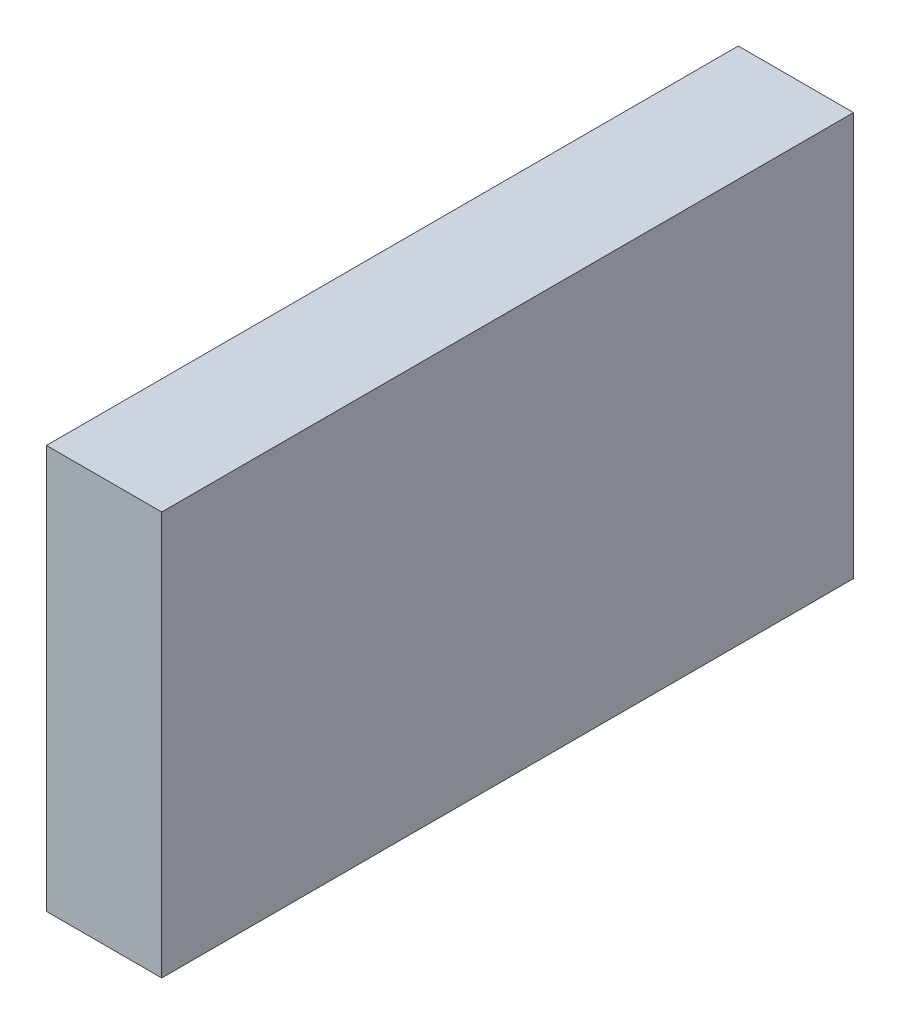
ISO-10303-21;
HEADER;
FILE_DESCRIPTION(('STEP AP214'),'2;1');
FILE_NAME('part.step','',(''),(''),'','','');
FILE_SCHEMA(('AUTOMOTIVE_DESIGN { 1 0 10303 214 1 1 1 1 }'));
ENDSEC;
DATA;
#1=APPLICATION_CONTEXT('core data for automotive mechanical design processes');
#2=APPLICATION_PROTOCOL_DEFINITION('international standard','automotive_design',2000,#1);
#3=PRODUCT_CONTEXT('',#1,'mechanical');
#4=PRODUCT('Part','Part','',(#3));
#5=PRODUCT_RELATED_PRODUCT_CATEGORY('part','',(#4));
#6=PRODUCT_DEFINITION_FORMATION('','',#4);
#7=PRODUCT_DEFINITION_CONTEXT('part definition',#1,'design');
#8=PRODUCT_DEFINITION('design','',#6,#7);
#9=PRODUCT_DEFINITION_SHAPE('','',#8);
#10=(LENGTH_UNIT() NAMED_UNIT(*) SI_UNIT(.MILLI.,.METRE.));
#11=(NAMED_UNIT(*) PLANE_ANGLE_UNIT() SI_UNIT($,.RADIAN.));
#12=(NAMED_UNIT(*) SI_UNIT($,.STERADIAN.) SOLID_ANGLE_UNIT());
#13=UNCERTAINTY_MEASURE_WITH_UNIT(LENGTH_MEASURE(1.E-05),#10,'distance_accuracy_value','');
#14=(GEOMETRIC_REPRESENTATION_CONTEXT(3) GLOBAL_UNCERTAINTY_ASSIGNED_CONTEXT((#13)) GLOBAL_UNIT_ASSIGNED_CONTEXT((#10,
#11,#12)) REPRESENTATION_CONTEXT('',''));
#15=CARTESIAN_POINT('',(0.,0.,0.));
#16=DIRECTION('',(0.,0.,1.));
#17=DIRECTION('',(1.,0.,0.));
#18=AXIS2_PLACEMENT_3D('',#15,#16,#17);
#19=CARTESIAN_POINT('',(-25.4,-88.9,304.8));
#20=DIRECTION('',(1.,0.,0.));
#21=DIRECTION('',(0.,0.,-1.));
#22=AXIS2_PLACEMENT_3D('',#19,#20,#21);
#23=PLANE('',#22);
#24=DIRECTION('',(0.,-1.,0.));
#25=VECTOR('',#24,1.);
#26=CARTESIAN_POINT('',(-25.4,-88.9,0.));
#27=LINE('',#26,#25);
#28=CARTESIAN_POINT('',(-25.4,88.9,0.));
#29=VERTEX_POINT('',#28);
#30=CARTESIAN_POINT('',(-25.4,-88.9,0.));
#31=VERTEX_POINT('',#30);
#32=EDGE_CURVE('E113',#29,#31,#27,.T.);
#33=ORIENTED_EDGE('',*,*,#32,.T.);
#34=DIRECTION('',(0.,0.,-1.));
#35=VECTOR('',#34,1.);
#36=CARTESIAN_POINT('',(-25.4,-88.9,304.8));
#37=LINE('',#36,#35);
#38=CARTESIAN_POINT('',(-25.4,-88.9,304.8));
#39=VERTEX_POINT('',#38);
#40=EDGE_CURVE('E11',#39,#31,#37,.T.);
#41=ORIENTED_EDGE('',*,*,#40,.F.);
#42=DIRECTION('',(0.,-1.,0.));
#43=VECTOR('',#42,1.);
#44=CARTESIAN_POINT('',(-25.4,-88.9,304.8));
#45=LINE('',#44,#43);
#46=CARTESIAN_POINT('',(-25.4,88.9,304.8));
#47=VERTEX_POINT('',#46);
#48=EDGE_CURVE('E97',#47,#39,#45,.T.);
#49=ORIENTED_EDGE('',*,*,#48,.F.);
#50=DIRECTION('',(0.,0.,-1.));
#51=VECTOR('',#50,1.);
#52=CARTESIAN_POINT('',(-25.4,88.9,304.8));
#53=LINE('',#52,#51);
#54=EDGE_CURVE('E109',#47,#29,#53,.T.);
#55=ORIENTED_EDGE('',*,*,#54,.T.);
#56=EDGE_LOOP('',(#33,#41,#49,#55));
#57=FACE_BOUND('',#56,.T.);
#58=ADVANCED_FACE('F45',(#57),#23,.F.);
#59=CARTESIAN_POINT('',(25.4,-88.9,304.8));
#60=DIRECTION('',(0.,1.,0.));
#61=DIRECTION('',(-1.,0.,0.));
#62=AXIS2_PLACEMENT_3D('',#59,#60,#61);
#63=PLANE('',#62);
#64=DIRECTION('',(1.,0.,0.));
#65=VECTOR('',#64,1.);
#66=CARTESIAN_POINT('',(25.4,-88.9,0.));
#67=LINE('',#66,#65);
#68=CARTESIAN_POINT('',(25.4,-88.9,0.));
#69=VERTEX_POINT('',#68);
#70=EDGE_CURVE('E102',#31,#69,#67,.T.);
#71=ORIENTED_EDGE('',*,*,#70,.T.);
#72=DIRECTION('',(0.,0.,-1.));
#73=VECTOR('',#72,1.);
#74=CARTESIAN_POINT('',(25.4,-88.9,304.8));
#75=LINE('',#74,#73);
#76=CARTESIAN_POINT('',(25.4,-88.9,304.8));
#77=VERTEX_POINT('',#76);
#78=EDGE_CURVE('E54',#77,#69,#75,.T.);
#79=ORIENTED_EDGE('',*,*,#78,.F.);
#80=DIRECTION('',(1.,0.,0.));
#81=VECTOR('',#80,1.);
#82=CARTESIAN_POINT('',(25.4,-88.9,304.8));
#83=LINE('',#82,#81);
#84=EDGE_CURVE('E92',#39,#77,#83,.T.);
#85=ORIENTED_EDGE('',*,*,#84,.F.);
#86=ORIENTED_EDGE('',*,*,#40,.T.);
#87=EDGE_LOOP('',(#71,#79,#85,#86));
#88=FACE_BOUND('',#87,.T.);
#89=ADVANCED_FACE('F101',(#88),#63,.F.);
#90=CARTESIAN_POINT('',(25.4,-88.9,304.8));
#91=DIRECTION('',(-1.,0.,0.));
#92=DIRECTION('',(0.,0.,1.));
#93=AXIS2_PLACEMENT_3D('',#90,#91,#92);
#94=PLANE('',#93);
#95=DIRECTION('',(0.,1.,0.));
#96=VECTOR('',#95,1.);
#97=CARTESIAN_POINT('',(25.4,-88.9,0.));
#98=LINE('',#97,#96);
#99=CARTESIAN_POINT('',(25.4,88.9,0.));
#100=VERTEX_POINT('',#99);
#101=EDGE_CURVE('E79',#69,#100,#98,.T.);
#102=ORIENTED_EDGE('',*,*,#101,.T.);
#103=DIRECTION('',(0.,0.,-1.));
#104=VECTOR('',#103,1.);
#105=CARTESIAN_POINT('',(25.4,88.9,304.8));
#106=LINE('',#105,#104);
#107=CARTESIAN_POINT('',(25.4,88.9,304.8));
#108=VERTEX_POINT('',#107);
#109=EDGE_CURVE('E104',#108,#100,#106,.T.);
#110=ORIENTED_EDGE('',*,*,#109,.F.);
#111=DIRECTION('',(0.,1.,0.));
#112=VECTOR('',#111,1.);
#113=CARTESIAN_POINT('',(25.4,-88.9,304.8));
#114=LINE('',#113,#112);
#115=EDGE_CURVE('E95',#77,#108,#114,.T.);
#116=ORIENTED_EDGE('',*,*,#115,.F.);
#117=ORIENTED_EDGE('',*,*,#78,.T.);
#118=EDGE_LOOP('',(#102,#110,#116,#117));
#119=FACE_BOUND('',#118,.T.);
#120=ADVANCED_FACE('F105',(#119),#94,.F.);
#121=CARTESIAN_POINT('',(25.4,88.9,304.8));
#122=DIRECTION('',(0.,-1.,0.));
#123=DIRECTION('',(0.,0.,-1.));
#124=AXIS2_PLACEMENT_3D('',#121,#122,#123);
#125=PLANE('',#124);
#126=DIRECTION('',(-1.,0.,0.));
#127=VECTOR('',#126,1.);
#128=CARTESIAN_POINT('',(25.4,88.9,0.));
#129=LINE('',#128,#127);
#130=EDGE_CURVE('E85',#100,#29,#129,.T.);
#131=ORIENTED_EDGE('',*,*,#130,.T.);
#132=ORIENTED_EDGE('',*,*,#54,.F.);
#133=DIRECTION('',(-1.,0.,0.));
#134=VECTOR('',#133,1.);
#135=CARTESIAN_POINT('',(25.4,88.9,304.8));
#136=LINE('',#135,#134);
#137=EDGE_CURVE('E62',#108,#47,#136,.T.);
#138=ORIENTED_EDGE('',*,*,#137,.F.);
#139=ORIENTED_EDGE('',*,*,#109,.T.);
#140=EDGE_LOOP('',(#131,#132,#138,#139));
#141=FACE_BOUND('',#140,.T.);
#142=ADVANCED_FACE('F126',(#141),#125,.F.);
#143=CARTESIAN_POINT('',(0.,0.,304.8));
#144=DIRECTION('',(0.,0.,1.));
#145=DIRECTION('',(1.,0.,0.));
#146=AXIS2_PLACEMENT_3D('',#143,#144,#145);
#147=PLANE('',#146);
#148=ORIENTED_EDGE('',*,*,#48,.T.);
#149=ORIENTED_EDGE('',*,*,#84,.T.);
#150=ORIENTED_EDGE('',*,*,#115,.T.);
#151=ORIENTED_EDGE('',*,*,#137,.T.);
#152=EDGE_LOOP('',(#148,#149,#150,#151));
#153=FACE_BOUND('',#152,.T.);
#154=ADVANCED_FACE('F93',(#153),#147,.T.);
#155=CARTESIAN_POINT('',(0.,0.,0.));
#156=DIRECTION('',(0.,0.,1.));
#157=DIRECTION('',(1.,0.,0.));
#158=AXIS2_PLACEMENT_3D('',#155,#156,#157);
#159=PLANE('',#158);
#160=ORIENTED_EDGE('',*,*,#32,.F.);
#161=ORIENTED_EDGE('',*,*,#130,.F.);
#162=ORIENTED_EDGE('',*,*,#101,.F.);
#163=ORIENTED_EDGE('',*,*,#70,.F.);
#164=EDGE_LOOP('',(#160,#161,#162,#163));
#165=FACE_BOUND('',#164,.T.);
#166=ADVANCED_FACE('F129',(#165),#159,.F.);
#167=CLOSED_SHELL('',(#58,#89,#120,#142,#154,#166));
#168=MANIFOLD_SOLID_BREP('B2',#167);
#169=ADVANCED_BREP_SHAPE_REPRESENTATION('',(#18,#168),#14);
#170=SHAPE_DEFINITION_REPRESENTATION(#9,#169);
ENDSEC;
END-ISO-10303-21;
